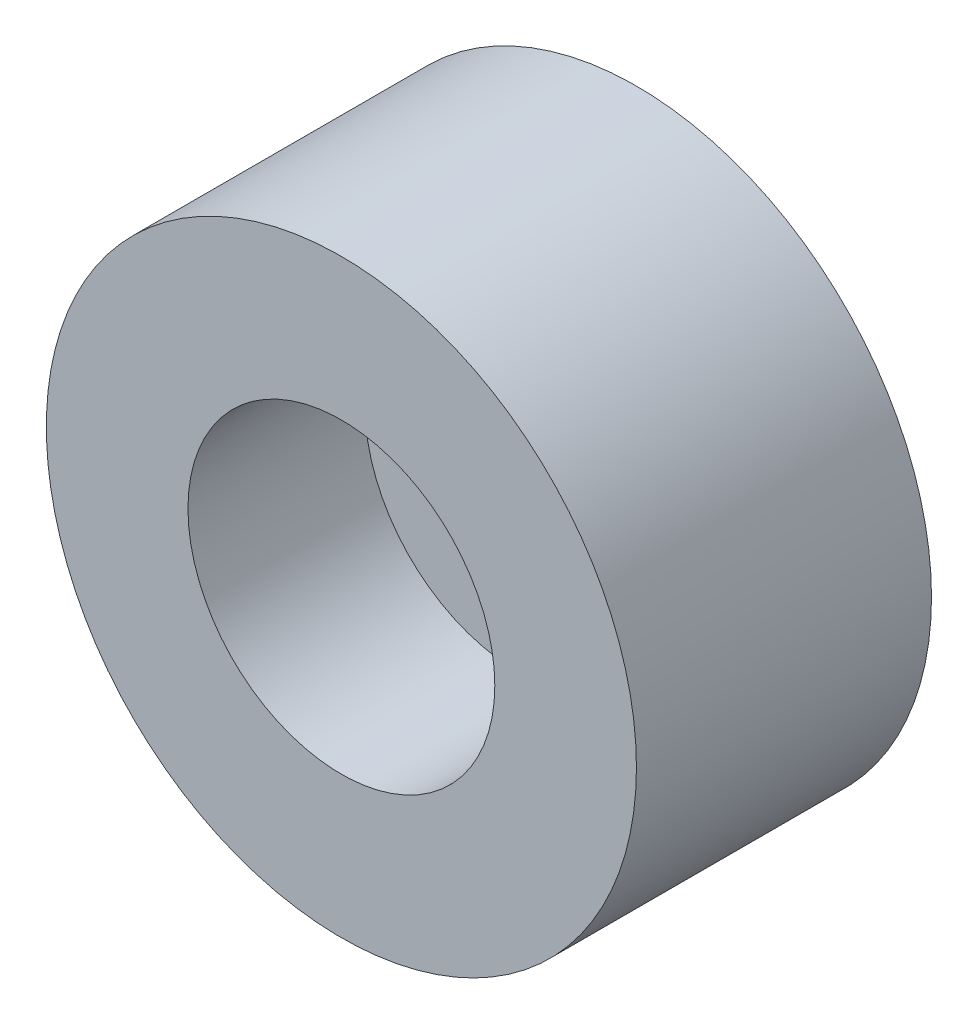
ISO-10303-21;
HEADER;
FILE_DESCRIPTION(('STEP AP214'),'2;1');
FILE_NAME('part.step','',(''),(''),'','','');
FILE_SCHEMA(('AUTOMOTIVE_DESIGN { 1 0 10303 214 1 1 1 1 }'));
ENDSEC;
DATA;
#1=APPLICATION_CONTEXT('core data for automotive mechanical design processes');
#2=APPLICATION_PROTOCOL_DEFINITION('international standard','automotive_design',2000,#1);
#3=PRODUCT_CONTEXT('',#1,'mechanical');
#4=PRODUCT('Part','Part','',(#3));
#5=PRODUCT_RELATED_PRODUCT_CATEGORY('part','',(#4));
#6=PRODUCT_DEFINITION_FORMATION('','',#4);
#7=PRODUCT_DEFINITION_CONTEXT('part definition',#1,'design');
#8=PRODUCT_DEFINITION('design','',#6,#7);
#9=PRODUCT_DEFINITION_SHAPE('','',#8);
#10=(LENGTH_UNIT() NAMED_UNIT(*) SI_UNIT(.MILLI.,.METRE.));
#11=(NAMED_UNIT(*) PLANE_ANGLE_UNIT() SI_UNIT($,.RADIAN.));
#12=(NAMED_UNIT(*) SI_UNIT($,.STERADIAN.) SOLID_ANGLE_UNIT());
#13=UNCERTAINTY_MEASURE_WITH_UNIT(LENGTH_MEASURE(1.E-05),#10,'distance_accuracy_value','');
#14=(GEOMETRIC_REPRESENTATION_CONTEXT(3) GLOBAL_UNCERTAINTY_ASSIGNED_CONTEXT((#13)) GLOBAL_UNIT_ASSIGNED_CONTEXT((#10,
#11,#12)) REPRESENTATION_CONTEXT('',''));
#15=CARTESIAN_POINT('',(0.,0.,0.));
#16=DIRECTION('',(0.,0.,1.));
#17=DIRECTION('',(1.,0.,0.));
#18=AXIS2_PLACEMENT_3D('',#15,#16,#17);
#19=CARTESIAN_POINT('',(0.,0.,12.7));
#20=DIRECTION('',(0.,0.,1.));
#21=DIRECTION('',(1.,0.,0.));
#22=AXIS2_PLACEMENT_3D('',#19,#20,#21);
#23=PLANE('',#22);
#24=CARTESIAN_POINT('',(0.,0.,12.7));
#25=DIRECTION('',(0.,0.,1.));
#26=DIRECTION('',(1.,0.,0.));
#27=AXIS2_PLACEMENT_3D('',#24,#25,#26);
#28=CIRCLE('',#27,12.7);
#29=CARTESIAN_POINT('',(12.7,0.,12.7));
#30=VERTEX_POINT('',#29);
#31=EDGE_CURVE('E53',#30,#30,#28,.T.);
#32=ORIENTED_EDGE('',*,*,#31,.T.);
#33=EDGE_LOOP('',(#32));
#34=FACE_BOUND('',#33,.T.);
#35=CARTESIAN_POINT('',(0.,0.,12.7));
#36=DIRECTION('',(0.,0.,1.));
#37=DIRECTION('',(1.,0.,0.));
#38=AXIS2_PLACEMENT_3D('',#35,#36,#37);
#39=CIRCLE('',#38,6.604);
#40=CARTESIAN_POINT('',(6.604,0.,12.7));
#41=VERTEX_POINT('',#40);
#42=EDGE_CURVE('E64',#41,#41,#39,.T.);
#43=ORIENTED_EDGE('',*,*,#42,.F.);
#44=EDGE_LOOP('',(#43));
#45=FACE_BOUND('',#44,.T.);
#46=ADVANCED_FACE('F45',(#34,#45),#23,.T.);
#47=CARTESIAN_POINT('',(0.,0.,0.));
#48=DIRECTION('',(0.,0.,1.));
#49=DIRECTION('',(1.,0.,0.));
#50=AXIS2_PLACEMENT_3D('',#47,#48,#49);
#51=PLANE('',#50);
#52=CARTESIAN_POINT('',(0.,0.,0.));
#53=DIRECTION('',(0.,0.,1.));
#54=DIRECTION('',(1.,0.,0.));
#55=AXIS2_PLACEMENT_3D('',#52,#53,#54);
#56=CIRCLE('',#55,12.7);
#57=CARTESIAN_POINT('',(12.7,0.,0.));
#58=VERTEX_POINT('',#57);
#59=EDGE_CURVE('E58',#58,#58,#56,.T.);
#60=ORIENTED_EDGE('',*,*,#59,.F.);
#61=EDGE_LOOP('',(#60));
#62=FACE_BOUND('',#61,.T.);
#63=ADVANCED_FACE('F73',(#62),#51,.F.);
#64=CARTESIAN_POINT('',(0.,0.,12.7));
#65=DIRECTION('',(0.,0.,-1.));
#66=DIRECTION('',(-1.,0.,0.));
#67=AXIS2_PLACEMENT_3D('',#64,#65,#66);
#68=CYLINDRICAL_SURFACE('',#67,12.7);
#69=ORIENTED_EDGE('',*,*,#31,.F.);
#70=EDGE_LOOP('',(#69));
#71=FACE_BOUND('',#70,.T.);
#72=ORIENTED_EDGE('',*,*,#59,.T.);
#73=EDGE_LOOP('',(#72));
#74=FACE_BOUND('',#73,.T.);
#75=ADVANCED_FACE('F47',(#71,#74),#68,.T.);
#76=CARTESIAN_POINT('',(0.,0.,12.7));
#77=DIRECTION('',(0.,0.,-1.));
#78=DIRECTION('',(-1.,0.,0.));
#79=AXIS2_PLACEMENT_3D('',#76,#77,#78);
#80=CYLINDRICAL_SURFACE('',#79,6.604);
#81=CARTESIAN_POINT('',(0.,0.,5.08));
#82=DIRECTION('',(0.,0.,1.));
#83=DIRECTION('',(1.,0.,0.));
#84=AXIS2_PLACEMENT_3D('',#81,#82,#83);
#85=CIRCLE('',#84,6.604);
#86=CARTESIAN_POINT('',(6.604,0.,5.08));
#87=VERTEX_POINT('',#86);
#88=EDGE_CURVE('E10',#87,#87,#85,.T.);
#89=ORIENTED_EDGE('',*,*,#88,.F.);
#90=EDGE_LOOP('',(#89));
#91=FACE_BOUND('',#90,.T.);
#92=ORIENTED_EDGE('',*,*,#42,.T.);
#93=EDGE_LOOP('',(#92));
#94=FACE_BOUND('',#93,.T.);
#95=ADVANCED_FACE('F70',(#91,#94),#80,.F.);
#96=CARTESIAN_POINT('',(0.,0.,5.08));
#97=DIRECTION('',(0.,0.,1.));
#98=DIRECTION('',(1.,0.,0.));
#99=AXIS2_PLACEMENT_3D('',#96,#97,#98);
#100=PLANE('',#99);
#101=ORIENTED_EDGE('',*,*,#88,.T.);
#102=EDGE_LOOP('',(#101));
#103=FACE_BOUND('',#102,.T.);
#104=ADVANCED_FACE('F83',(#103),#100,.T.);
#105=CLOSED_SHELL('',(#46,#63,#75,#95,#104));
#106=MANIFOLD_SOLID_BREP('B2',#105);
#107=ADVANCED_BREP_SHAPE_REPRESENTATION('',(#18,#106),#14);
#108=SHAPE_DEFINITION_REPRESENTATION(#9,#107);
ENDSEC;
END-ISO-10303-21;
